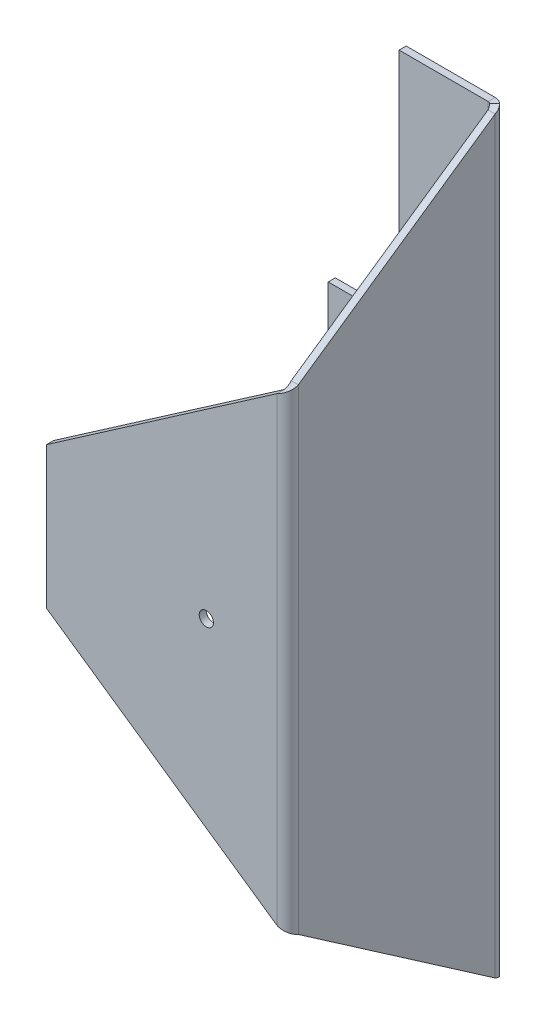
ISO-10303-21;
HEADER;
FILE_DESCRIPTION(('STEP AP214'),'2;1');
FILE_NAME('part.step','',(''),(''),'','','');
FILE_SCHEMA(('AUTOMOTIVE_DESIGN { 1 0 10303 214 1 1 1 1 }'));
ENDSEC;
DATA;
#1=APPLICATION_CONTEXT('core data for automotive mechanical design processes');
#2=APPLICATION_PROTOCOL_DEFINITION('international standard','automotive_design',2000,#1);
#3=PRODUCT_CONTEXT('',#1,'mechanical');
#4=PRODUCT('Part','Part','',(#3));
#5=PRODUCT_RELATED_PRODUCT_CATEGORY('part','',(#4));
#6=PRODUCT_DEFINITION_FORMATION('','',#4);
#7=PRODUCT_DEFINITION_CONTEXT('part definition',#1,'design');
#8=PRODUCT_DEFINITION('design','',#6,#7);
#9=PRODUCT_DEFINITION_SHAPE('','',#8);
#10=(LENGTH_UNIT() NAMED_UNIT(*) SI_UNIT(.MILLI.,.METRE.));
#11=(NAMED_UNIT(*) PLANE_ANGLE_UNIT() SI_UNIT($,.RADIAN.));
#12=(NAMED_UNIT(*) SI_UNIT($,.STERADIAN.) SOLID_ANGLE_UNIT());
#13=UNCERTAINTY_MEASURE_WITH_UNIT(LENGTH_MEASURE(1.E-05),#10,'distance_accuracy_value','');
#14=(GEOMETRIC_REPRESENTATION_CONTEXT(3) GLOBAL_UNCERTAINTY_ASSIGNED_CONTEXT((#13)) GLOBAL_UNIT_ASSIGNED_CONTEXT((#10,
#11,#12)) REPRESENTATION_CONTEXT('',''));
#15=CARTESIAN_POINT('',(0.,0.,0.));
#16=DIRECTION('',(0.,0.,1.));
#17=DIRECTION('',(1.,0.,0.));
#18=AXIS2_PLACEMENT_3D('',#15,#16,#17);
#19=CARTESIAN_POINT('',(83.9999999999999,0.,44.6380541805872));
#20=DIRECTION('',(0.,0.,-1.));
#21=DIRECTION('',(-1.,0.,0.));
#22=AXIS2_PLACEMENT_3D('',#19,#20,#21);
#23=PLANE('',#22);
#24=DIRECTION('',(-0.822507068450492,0.568754887758319,0.));
#25=VECTOR('',#24,1.);
#26=CARTESIAN_POINT('',(63.9999999999998,0.,44.638054180587));
#27=LINE('',#26,#25);
#28=CARTESIAN_POINT('',(18.8324270902932,31.2328961609673,44.6380541805867));
#29=VERTEX_POINT('',#28);
#30=CARTESIAN_POINT('',(-30.0000000000002,65.,44.6380541805864));
#31=VERTEX_POINT('',#30);
#32=EDGE_CURVE('E400',#29,#31,#27,.T.);
#33=ORIENTED_EDGE('',*,*,#32,.F.);
#34=DIRECTION('',(0.,1.,0.));
#35=VECTOR('',#34,1.);
#36=CARTESIAN_POINT('',(18.8324270902932,0.,44.6380541805867));
#37=LINE('',#36,#35);
#38=CARTESIAN_POINT('',(18.8324270902932,128.767103839033,44.6380541805867));
#39=VERTEX_POINT('',#38);
#40=EDGE_CURVE('E564',#29,#39,#37,.T.);
#41=ORIENTED_EDGE('',*,*,#40,.T.);
#42=DIRECTION('',(0.822507068450492,0.568754887758319,0.));
#43=VECTOR('',#42,1.);
#44=CARTESIAN_POINT('',(63.9999999999999,160.,44.638054180587));
#45=LINE('',#44,#43);
#46=CARTESIAN_POINT('',(-30.0000000000002,95.,44.6380541805864));
#47=VERTEX_POINT('',#46);
#48=EDGE_CURVE('E559',#47,#39,#45,.T.);
#49=ORIENTED_EDGE('',*,*,#48,.F.);
#50=DIRECTION('',(0.,1.,0.));
#51=VECTOR('',#50,1.);
#52=CARTESIAN_POINT('',(-30.0000000000002,95.,44.6380541805864));
#53=LINE('',#52,#51);
#54=EDGE_CURVE('E442',#31,#47,#53,.T.);
#55=ORIENTED_EDGE('',*,*,#54,.F.);
#56=EDGE_LOOP('',(#33,#41,#49,#55));
#57=FACE_BOUND('',#56,.T.);
#58=CARTESIAN_POINT('',(3.8324270902932,80.,44.6380541805866));
#59=DIRECTION('',(0.,0.,1.));
#60=DIRECTION('',(1.,0.,0.));
#61=AXIS2_PLACEMENT_3D('',#58,#59,#60);
#62=CIRCLE('',#61,1.49999999999999);
#63=CARTESIAN_POINT('',(5.33242709029318,80.,44.6380541805866));
#64=VERTEX_POINT('',#63);
#65=EDGE_CURVE('E323',#64,#64,#62,.T.);
#66=ORIENTED_EDGE('',*,*,#65,.F.);
#67=EDGE_LOOP('',(#66));
#68=FACE_BOUND('',#67,.T.);
#69=ADVANCED_FACE('F84',(#57,#68),#23,.F.);
#70=CARTESIAN_POINT('',(21.0690270902934,0.,-20.4309729097066));
#71=DIRECTION('',(-1.,0.,0.));
#72=DIRECTION('',(0.,0.,1.));
#73=AXIS2_PLACEMENT_3D('',#70,#71,#72);
#74=PLANE('',#73);
#75=DIRECTION('',(0.,0.568754887758319,0.822507068450492));
#76=VECTOR('',#75,1.);
#77=CARTESIAN_POINT('',(21.0690270902934,0.,-0.430972909706617));
#78=LINE('',#77,#76);
#79=CARTESIAN_POINT('',(21.0690270902934,0.807364246073722,0.736600000000007));
#80=VERTEX_POINT('',#79);
#81=CARTESIAN_POINT('',(21.0690270902932,29.6181676688199,42.4014541805867));
#82=VERTEX_POINT('',#81);
#83=EDGE_CURVE('E364',#80,#82,#78,.T.);
#84=ORIENTED_EDGE('',*,*,#83,.F.);
#85=DIRECTION('',(0.,1.,0.));
#86=VECTOR('',#85,1.);
#87=CARTESIAN_POINT('',(21.0690270902934,0.,0.736600000000007));
#88=LINE('',#87,#86);
#89=CARTESIAN_POINT('',(21.0690270902933,159.192635753926,0.736600000000011));
#90=VERTEX_POINT('',#89);
#91=EDGE_CURVE('E244',#80,#90,#88,.T.);
#92=ORIENTED_EDGE('',*,*,#91,.T.);
#93=DIRECTION('',(0.,0.568754887758319,-0.822507068450492));
#94=VECTOR('',#93,1.);
#95=CARTESIAN_POINT('',(21.0690270902934,160.,-0.430972909706655));
#96=LINE('',#95,#94);
#97=CARTESIAN_POINT('',(21.0690270902932,130.38183233118,42.4014541805867));
#98=VERTEX_POINT('',#97);
#99=EDGE_CURVE('E383',#98,#90,#96,.T.);
#100=ORIENTED_EDGE('',*,*,#99,.F.);
#101=DIRECTION('',(0.,1.,0.));
#102=VECTOR('',#101,1.);
#103=CARTESIAN_POINT('',(21.0690270902932,0.,42.4014541805867));
#104=LINE('',#103,#102);
#105=EDGE_CURVE('E387',#82,#98,#104,.T.);
#106=ORIENTED_EDGE('',*,*,#105,.F.);
#107=EDGE_LOOP('',(#84,#92,#100,#106));
#108=FACE_BOUND('',#107,.T.);
#109=ADVANCED_FACE('F736',(#108),#74,.F.);
#110=CARTESIAN_POINT('',(21.0690270902934,160.,-0.430972909706655));
#111=DIRECTION('',(0.,0.822507068450492,0.568754887758319));
#112=DIRECTION('',(0.,0.568754887758319,-0.822507068450492));
#113=AXIS2_PLACEMENT_3D('',#110,#111,#112);
#114=PLANE('',#113);
#115=CARTESIAN_POINT('',(19.5690270902934,159.192635753926,0.7366));
#116=CARTESIAN_POINT('',(21.0690270902934,159.192635753926,0.736599999999999));
#117=B_SPLINE_CURVE_WITH_KNOTS('',1,(#115,#116),.UNSPECIFIED.,.F.,.F.,(2,2),(0.,1.),.UNSPECIFIED.);
#118=CARTESIAN_POINT('',(19.5690270902934,159.192635753926,0.7366));
#119=VERTEX_POINT('',#118);
#120=EDGE_CURVE('E14',#119,#90,#117,.T.);
#121=ORIENTED_EDGE('',*,*,#120,.F.);
#122=DIRECTION('',(0.,0.568754887758319,-0.822507068450492));
#123=VECTOR('',#122,1.);
#124=CARTESIAN_POINT('',(19.5690270902934,160.,-0.430972909706662));
#125=LINE('',#124,#123);
#126=CARTESIAN_POINT('',(19.5690270902932,130.38183233118,42.4014541805867));
#127=VERTEX_POINT('',#126);
#128=EDGE_CURVE('E358',#127,#119,#125,.T.);
#129=ORIENTED_EDGE('',*,*,#128,.F.);
#130=CARTESIAN_POINT('',(21.0690270902932,130.38183233118,42.4014541805867));
#131=CARTESIAN_POINT('',(19.5690270902932,130.38183233118,42.4014541805867));
#132=B_SPLINE_CURVE_WITH_KNOTS('',1,(#130,#131),.UNSPECIFIED.,.F.,.F.,(2,2),(0.,1.),.UNSPECIFIED.);
#133=EDGE_CURVE('E389',#127,#98,#132,.F.);
#134=ORIENTED_EDGE('',*,*,#133,.T.);
#135=ORIENTED_EDGE('',*,*,#99,.T.);
#136=EDGE_LOOP('',(#121,#129,#134,#135));
#137=FACE_BOUND('',#136,.T.);
#138=ADVANCED_FACE('F86',(#137),#114,.T.);
#139=CARTESIAN_POINT('',(21.0690270902934,0.,-0.430972909706617));
#140=DIRECTION('',(0.,-0.822507068450492,0.568754887758319));
#141=DIRECTION('',(0.,0.568754887758319,0.822507068450492));
#142=AXIS2_PLACEMENT_3D('',#139,#140,#141);
#143=PLANE('',#142);
#144=CARTESIAN_POINT('',(21.0690270902934,0.807364246073722,0.736599999999999));
#145=CARTESIAN_POINT('',(19.5690270902934,0.807364246073722,0.7366));
#146=B_SPLINE_CURVE_WITH_KNOTS('',1,(#144,#145),.UNSPECIFIED.,.F.,.F.,(2,2),(0.,1.),.UNSPECIFIED.);
#147=CARTESIAN_POINT('',(19.5690270902934,0.807364246073722,0.736600000000002));
#148=VERTEX_POINT('',#147);
#149=EDGE_CURVE('E1063',#80,#148,#146,.T.);
#150=ORIENTED_EDGE('',*,*,#149,.F.);
#151=ORIENTED_EDGE('',*,*,#83,.T.);
#152=CARTESIAN_POINT('',(19.5690270902932,29.6181676688199,42.4014541805867));
#153=CARTESIAN_POINT('',(21.0690270902932,29.6181676688199,42.4014541805867));
#154=B_SPLINE_CURVE_WITH_KNOTS('',1,(#152,#153),.UNSPECIFIED.,.F.,.F.,(2,2),(0.,1.),.UNSPECIFIED.);
#155=CARTESIAN_POINT('',(19.5690270902932,29.6181676688198,42.4014541805867));
#156=VERTEX_POINT('',#155);
#157=EDGE_CURVE('E510',#82,#156,#154,.F.);
#158=ORIENTED_EDGE('',*,*,#157,.T.);
#159=DIRECTION('',(0.,0.568754887758319,0.822507068450492));
#160=VECTOR('',#159,1.);
#161=CARTESIAN_POINT('',(19.5690270902934,0.,-0.430972909706624));
#162=LINE('',#161,#160);
#163=EDGE_CURVE('E352',#148,#156,#162,.T.);
#164=ORIENTED_EDGE('',*,*,#163,.F.);
#165=EDGE_LOOP('',(#150,#151,#158,#164));
#166=FACE_BOUND('',#165,.T.);
#167=ADVANCED_FACE('F778',(#166),#143,.T.);
#168=CARTESIAN_POINT('',(19.5690270902934,0.,-20.4309729097067));
#169=DIRECTION('',(-1.,0.,0.));
#170=DIRECTION('',(0.,0.,1.));
#171=AXIS2_PLACEMENT_3D('',#168,#169,#170);
#172=PLANE('',#171);
#173=DIRECTION('',(0.,1.,0.));
#174=VECTOR('',#173,1.);
#175=CARTESIAN_POINT('',(19.5690270902934,0.,0.7366));
#176=LINE('',#175,#174);
#177=EDGE_CURVE('E95',#148,#119,#176,.T.);
#178=ORIENTED_EDGE('',*,*,#177,.F.);
#179=ORIENTED_EDGE('',*,*,#163,.T.);
#180=DIRECTION('',(0.,1.,0.));
#181=VECTOR('',#180,1.);
#182=CARTESIAN_POINT('',(19.5690270902932,0.,42.4014541805867));
#183=LINE('',#182,#181);
#184=EDGE_CURVE('E533',#156,#127,#183,.T.);
#185=ORIENTED_EDGE('',*,*,#184,.T.);
#186=ORIENTED_EDGE('',*,*,#128,.T.);
#187=EDGE_LOOP('',(#178,#179,#185,#186));
#188=FACE_BOUND('',#187,.T.);
#189=ADVANCED_FACE('F772',(#188),#172,.T.);
#190=CARTESIAN_POINT('',(18.8324270902932,31.2328961609674,44.6380541805867));
#191=CARTESIAN_POINT('',(19.1252409254243,31.0983154235121,44.6380541805867));
#192=CARTESIAN_POINT('',(19.4178524084512,30.9637747456094,44.5798414692231));
#193=CARTESIAN_POINT('',(19.9588213017907,30.6946533302515,44.3557648167798));
#194=CARTESIAN_POINT('',(20.2069222841891,30.5600926225726,44.1899890402945));
#195=CARTESIAN_POINT('',(20.620961950001,30.2909712072147,43.7759493744826));
#196=CARTESIAN_POINT('',(20.7867377264863,30.1564104995357,43.5278483920843));
#197=CARTESIAN_POINT('',(21.0108143789296,29.8872890841778,42.9868794987447));
#198=CARTESIAN_POINT('',(21.0690270902932,29.7527484062751,42.6942680157179));
#199=CARTESIAN_POINT('',(21.0690270902932,29.6181676688199,42.4014541805867));
#200=CARTESIAN_POINT('',(18.8324270902932,31.2328961609674,43.1380541805867));
#201=CARTESIAN_POINT('',(18.9288537026675,31.0983272224992,43.1380541805867));
#202=CARTESIAN_POINT('',(19.0252305819122,30.9637747456094,43.1188824542206));
#203=CARTESIAN_POINT('',(19.2033928312344,30.6946533302515,43.0450852342485));
#204=CARTESIAN_POINT('',(19.2851022042267,30.5600926225726,42.9904887766972));
#205=CARTESIAN_POINT('',(19.4214616864037,30.2909712072147,42.8541292945202));
#206=CARTESIAN_POINT('',(19.476058143955,30.1564104995357,42.7724199215279));
#207=CARTESIAN_POINT('',(19.5498553639271,29.8872890841778,42.5942576722057));
#208=CARTESIAN_POINT('',(19.5690270902932,29.7527366072881,42.497880792961));
#209=CARTESIAN_POINT('',(19.5690270902932,29.6181676688199,42.4014541805867));
#210=B_SPLINE_SURFACE_WITH_KNOTS('',1,3,((#190,#191,#192,#193,#194,#195,#196,#197,#198,#199),
(#200,#201,#202,#203,#204,#205,#206,#207,#208,#209)),.UNSPECIFIED.,.F.,.F.,.F.,(2,2),(4,2,2,2,
4),(0.,1.),(0.,0.25,0.5,0.75,1.),.UNSPECIFIED.);
#211=CARTESIAN_POINT('',(18.8324270902932,31.2328961609674,44.6380541805867));
#212=CARTESIAN_POINT('',(18.8324270902932,31.2328961609674,43.1380541805867));
#213=B_SPLINE_CURVE_WITH_KNOTS('',1,(#211,#212),.UNSPECIFIED.,.F.,.F.,(2,2),(0.,1.),.UNSPECIFIED.);
#214=CARTESIAN_POINT('',(18.8324270902932,31.2328961609673,43.1380541805867));
#215=VERTEX_POINT('',#214);
#216=EDGE_CURVE('E520',#29,#215,#213,.T.);
#217=CARTESIAN_POINT('',(18.8324270902932,31.2328961609674,43.1380541805867));
#218=CARTESIAN_POINT('',(18.9288537026675,31.0983272224992,43.1380541805867));
#219=CARTESIAN_POINT('',(19.0252305819122,30.9637747456094,43.1188824542206));
#220=CARTESIAN_POINT('',(19.2033928312344,30.6946533302515,43.0450852342485));
#221=CARTESIAN_POINT('',(19.2851022042267,30.5600926225726,42.9904887766972));
#222=CARTESIAN_POINT('',(19.4214616864037,30.2909712072147,42.8541292945202));
#223=CARTESIAN_POINT('',(19.476058143955,30.1564104995357,42.7724199215279));
#224=CARTESIAN_POINT('',(19.5498553639271,29.8872890841778,42.5942576722057));
#225=CARTESIAN_POINT('',(19.5690270902932,29.7527366072881,42.497880792961));
#226=CARTESIAN_POINT('',(19.5690270902932,29.6181676688199,42.4014541805867));
#227=B_SPLINE_CURVE_WITH_KNOTS('',3,(#217,#218,#219,#220,#221,#222,#223,#224,#225,#226),
.UNSPECIFIED.,.F.,.F.,(4,2,2,2,4),(0.,0.25,0.5,0.75,1.),.UNSPECIFIED.);
#228=EDGE_CURVE('E102',#215,#156,#227,.T.);
#229=CARTESIAN_POINT('',(21.0690270902932,29.6181676688199,42.4014541805867));
#230=CARTESIAN_POINT('',(21.0690270902932,29.7527484062751,42.6942680157179));
#231=CARTESIAN_POINT('',(21.0108143789296,29.8872890841778,42.9868794987447));
#232=CARTESIAN_POINT('',(20.7867377264863,30.1564104995357,43.5278483920843));
#233=CARTESIAN_POINT('',(20.620961950001,30.2909712072147,43.7759493744826));
#234=CARTESIAN_POINT('',(20.2069222841891,30.5600926225726,44.1899890402945));
#235=CARTESIAN_POINT('',(19.9588213017907,30.6946533302515,44.3557648167798));
#236=CARTESIAN_POINT('',(19.4178524084512,30.9637747456094,44.5798414692231));
#237=CARTESIAN_POINT('',(19.1252409254243,31.0983154235121,44.6380541805867));
#238=CARTESIAN_POINT('',(18.8324270902932,31.2328961609674,44.6380541805867));
#239=B_SPLINE_CURVE_WITH_KNOTS('',3,(#229,#230,#231,#232,#233,#234,#235,#236,#237,#238),
.UNSPECIFIED.,.F.,.F.,(4,2,2,2,4),(0.,0.25,0.5,0.75,1.),.UNSPECIFIED.);
#240=EDGE_CURVE('E344',#29,#82,#239,.F.);
#241=ORIENTED_EDGE('',*,*,#216,.T.);
#242=ORIENTED_EDGE('',*,*,#228,.T.);
#243=ORIENTED_EDGE('',*,*,#157,.F.);
#244=ORIENTED_EDGE('',*,*,#240,.F.);
#245=EDGE_LOOP('',(#241,#242,#243,#244));
#246=FACE_BOUND('',#245,.T.);
#247=ADVANCED_FACE('F481',(#246),#210,.T.);
#248=CARTESIAN_POINT('',(21.0690270902932,130.38183233118,42.4014541805867));
#249=CARTESIAN_POINT('',(21.0690270902932,130.247251593725,42.6942680157178));
#250=CARTESIAN_POINT('',(21.0108143789296,130.112710915822,42.9868794987447));
#251=CARTESIAN_POINT('',(20.7867377264863,129.843589500464,43.5278483920843));
#252=CARTESIAN_POINT('',(20.620961950001,129.709028792785,43.7759493744826));
#253=CARTESIAN_POINT('',(20.2069222841891,129.439907377427,44.1899890402945));
#254=CARTESIAN_POINT('',(19.9588213017908,129.305346669749,44.3557648167798));
#255=CARTESIAN_POINT('',(19.4178524084512,129.036225254391,44.5798414692231));
#256=CARTESIAN_POINT('',(19.1252409254243,128.901684576488,44.6380541805867));
#257=CARTESIAN_POINT('',(18.8324270902932,128.767103839033,44.6380541805867));
#258=CARTESIAN_POINT('',(19.5690270902932,130.38183233118,42.4014541805867));
#259=CARTESIAN_POINT('',(19.5690270902932,130.247263392712,42.497880792961));
#260=CARTESIAN_POINT('',(19.5498553639271,130.112710915822,42.5942576722057));
#261=CARTESIAN_POINT('',(19.476058143955,129.843589500464,42.7724199215279));
#262=CARTESIAN_POINT('',(19.4214616864037,129.709028792785,42.8541292945202));
#263=CARTESIAN_POINT('',(19.2851022042267,129.439907377427,42.9904887766972));
#264=CARTESIAN_POINT('',(19.2033928312344,129.305346669749,43.0450852342485));
#265=CARTESIAN_POINT('',(19.0252305819123,129.036225254391,43.1188824542206));
#266=CARTESIAN_POINT('',(18.9288537026675,128.901672777501,43.1380541805867));
#267=CARTESIAN_POINT('',(18.8324270902932,128.767103839033,43.1380541805867));
#268=B_SPLINE_SURFACE_WITH_KNOTS('',1,3,((#248,#249,#250,#251,#252,#253,#254,#255,#256,#257),
(#258,#259,#260,#261,#262,#263,#264,#265,#266,#267)),.UNSPECIFIED.,.F.,.F.,.F.,(2,2),(4,2,2,2,
4),(0.,1.),(0.,0.25,0.5,0.75,1.),.UNSPECIFIED.);
#269=CARTESIAN_POINT('',(19.5690270902932,130.38183233118,42.4014541805867));
#270=CARTESIAN_POINT('',(19.5690270902932,130.247263392712,42.497880792961));
#271=CARTESIAN_POINT('',(19.5498553639271,130.112710915822,42.5942576722057));
#272=CARTESIAN_POINT('',(19.476058143955,129.843589500464,42.7724199215279));
#273=CARTESIAN_POINT('',(19.4214616864037,129.709028792785,42.8541292945202));
#274=CARTESIAN_POINT('',(19.2851022042267,129.439907377427,42.9904887766972));
#275=CARTESIAN_POINT('',(19.2033928312344,129.305346669749,43.0450852342485));
#276=CARTESIAN_POINT('',(19.0252305819123,129.036225254391,43.1188824542206));
#277=CARTESIAN_POINT('',(18.9288537026675,128.901672777501,43.1380541805867));
#278=CARTESIAN_POINT('',(18.8324270902932,128.767103839033,43.1380541805867));
#279=B_SPLINE_CURVE_WITH_KNOTS('',3,(#269,#270,#271,#272,#273,#274,#275,#276,#277,#278),
.UNSPECIFIED.,.F.,.F.,(4,2,2,2,4),(0.,0.25,0.5,0.75,1.),.UNSPECIFIED.);
#280=CARTESIAN_POINT('',(18.8324270902932,128.767103839033,43.1380541805867));
#281=VERTEX_POINT('',#280);
#282=EDGE_CURVE('E349',#127,#281,#279,.T.);
#283=CARTESIAN_POINT('',(18.8324270902932,128.767103839033,43.1380541805867));
#284=CARTESIAN_POINT('',(18.8324270902932,128.767103839033,44.6380541805867));
#285=B_SPLINE_CURVE_WITH_KNOTS('',1,(#283,#284),.UNSPECIFIED.,.F.,.F.,(2,2),(0.,1.),.UNSPECIFIED.);
#286=EDGE_CURVE('E530',#281,#39,#285,.T.);
#287=CARTESIAN_POINT('',(18.8324270902932,128.767103839033,44.6380541805867));
#288=CARTESIAN_POINT('',(19.1252409254243,128.901684576488,44.6380541805867));
#289=CARTESIAN_POINT('',(19.4178524084512,129.036225254391,44.5798414692231));
#290=CARTESIAN_POINT('',(19.9588213017908,129.305346669749,44.3557648167798));
#291=CARTESIAN_POINT('',(20.2069222841891,129.439907377427,44.1899890402945));
#292=CARTESIAN_POINT('',(20.620961950001,129.709028792785,43.7759493744826));
#293=CARTESIAN_POINT('',(20.7867377264863,129.843589500464,43.5278483920843));
#294=CARTESIAN_POINT('',(21.0108143789296,130.112710915822,42.9868794987447));
#295=CARTESIAN_POINT('',(21.0690270902932,130.247251593725,42.6942680157178));
#296=CARTESIAN_POINT('',(21.0690270902932,130.38183233118,42.4014541805867));
#297=B_SPLINE_CURVE_WITH_KNOTS('',3,(#287,#288,#289,#290,#291,#292,#293,#294,#295,#296),
.UNSPECIFIED.,.F.,.F.,(4,2,2,2,4),(0.,0.25,0.5,0.75,1.),.UNSPECIFIED.);
#298=EDGE_CURVE('E348',#98,#39,#297,.F.);
#299=ORIENTED_EDGE('',*,*,#133,.F.);
#300=ORIENTED_EDGE('',*,*,#282,.T.);
#301=ORIENTED_EDGE('',*,*,#286,.T.);
#302=ORIENTED_EDGE('',*,*,#298,.F.);
#303=EDGE_LOOP('',(#299,#300,#301,#302));
#304=FACE_BOUND('',#303,.T.);
#305=ADVANCED_FACE('F429',(#304),#268,.T.);
#306=CARTESIAN_POINT('',(18.8324270902932,180.801880052837,42.4014541805867));
#307=DIRECTION('',(0.,-1.,0.));
#308=DIRECTION('',(1.,0.,0.));
#309=AXIS2_PLACEMENT_3D('',#306,#307,#308);
#310=CYLINDRICAL_SURFACE('',#309,2.2366);
#311=ORIENTED_EDGE('',*,*,#298,.T.);
#312=ORIENTED_EDGE('',*,*,#40,.F.);
#313=ORIENTED_EDGE('',*,*,#240,.T.);
#314=ORIENTED_EDGE('',*,*,#105,.T.);
#315=EDGE_LOOP('',(#311,#312,#313,#314));
#316=FACE_BOUND('',#315,.T.);
#317=ADVANCED_FACE('F424',(#316),#310,.T.);
#318=CARTESIAN_POINT('',(18.8324270902932,180.801880052837,42.4014541805867));
#319=DIRECTION('',(0.,-1.,0.));
#320=DIRECTION('',(1.,0.,0.));
#321=AXIS2_PLACEMENT_3D('',#318,#319,#320);
#322=CYLINDRICAL_SURFACE('',#321,0.7366);
#323=ORIENTED_EDGE('',*,*,#282,.F.);
#324=ORIENTED_EDGE('',*,*,#184,.F.);
#325=ORIENTED_EDGE('',*,*,#228,.F.);
#326=DIRECTION('',(0.,1.,0.));
#327=VECTOR('',#326,1.);
#328=CARTESIAN_POINT('',(18.8324270902932,0.,43.1380541805867));
#329=LINE('',#328,#327);
#330=EDGE_CURVE('E542',#215,#281,#329,.T.);
#331=ORIENTED_EDGE('',*,*,#330,.T.);
#332=EDGE_LOOP('',(#323,#324,#325,#331));
#333=FACE_BOUND('',#332,.T.);
#334=ADVANCED_FACE('F428',(#333),#322,.F.);
#335=CARTESIAN_POINT('',(-30.0000000000002,95.,44.6380541805864));
#336=DIRECTION('',(-1.,0.,0.));
#337=DIRECTION('',(0.,1.,0.));
#338=AXIS2_PLACEMENT_3D('',#335,#336,#337);
#339=PLANE('',#338);
#340=DIRECTION('',(0.,1.,0.));
#341=VECTOR('',#340,1.);
#342=CARTESIAN_POINT('',(-30.0000000000002,95.,43.1380541805864));
#343=LINE('',#342,#341);
#344=CARTESIAN_POINT('',(-30.0000000000002,65.,43.1380541805864));
#345=VERTEX_POINT('',#344);
#346=CARTESIAN_POINT('',(-30.0000000000002,95.,43.1380541805864));
#347=VERTEX_POINT('',#346);
#348=EDGE_CURVE('E555',#345,#347,#343,.T.);
#349=ORIENTED_EDGE('',*,*,#348,.F.);
#350=DIRECTION('',(0.,0.,-1.));
#351=VECTOR('',#350,1.);
#352=CARTESIAN_POINT('',(-30.0000000000002,65.,44.6380541805864));
#353=LINE('',#352,#351);
#354=EDGE_CURVE('E402',#31,#345,#353,.T.);
#355=ORIENTED_EDGE('',*,*,#354,.F.);
#356=ORIENTED_EDGE('',*,*,#54,.T.);
#357=DIRECTION('',(0.,0.,-1.));
#358=VECTOR('',#357,1.);
#359=CARTESIAN_POINT('',(-30.0000000000002,95.,44.6380541805864));
#360=LINE('',#359,#358);
#361=EDGE_CURVE('E569',#47,#347,#360,.T.);
#362=ORIENTED_EDGE('',*,*,#361,.T.);
#363=EDGE_LOOP('',(#349,#355,#356,#362));
#364=FACE_BOUND('',#363,.T.);
#365=ADVANCED_FACE('F580',(#364),#339,.T.);
#366=CARTESIAN_POINT('',(63.9999999999999,160.,44.638054180587));
#367=DIRECTION('',(-0.568754887758319,0.822507068450492,0.));
#368=DIRECTION('',(0.822507068450492,0.568754887758319,0.));
#369=AXIS2_PLACEMENT_3D('',#366,#367,#368);
#370=PLANE('',#369);
#371=ORIENTED_EDGE('',*,*,#286,.F.);
#372=DIRECTION('',(0.822507068450492,0.568754887758319,0.));
#373=VECTOR('',#372,1.);
#374=CARTESIAN_POINT('',(63.9999999999999,160.,43.138054180587));
#375=LINE('',#374,#373);
#376=EDGE_CURVE('E403',#347,#281,#375,.T.);
#377=ORIENTED_EDGE('',*,*,#376,.F.);
#378=ORIENTED_EDGE('',*,*,#361,.F.);
#379=ORIENTED_EDGE('',*,*,#48,.T.);
#380=EDGE_LOOP('',(#371,#377,#378,#379));
#381=FACE_BOUND('',#380,.T.);
#382=ADVANCED_FACE('F576',(#381),#370,.T.);
#383=CARTESIAN_POINT('',(83.9999999999999,0.,43.1380541805872));
#384=DIRECTION('',(0.,0.,-1.));
#385=DIRECTION('',(-1.,0.,0.));
#386=AXIS2_PLACEMENT_3D('',#383,#384,#385);
#387=PLANE('',#386);
#388=CARTESIAN_POINT('',(3.8324270902932,80.,43.1380541805866));
#389=DIRECTION('',(0.,0.,-1.));
#390=DIRECTION('',(-1.,0.,0.));
#391=AXIS2_PLACEMENT_3D('',#388,#389,#390);
#392=CIRCLE('',#391,1.49999999999999);
#393=CARTESIAN_POINT('',(2.3324270902932,80.,43.1380541805866));
#394=VERTEX_POINT('',#393);
#395=EDGE_CURVE('E318',#394,#394,#392,.T.);
#396=ORIENTED_EDGE('',*,*,#395,.F.);
#397=EDGE_LOOP('',(#396));
#398=FACE_BOUND('',#397,.T.);
#399=ORIENTED_EDGE('',*,*,#330,.F.);
#400=DIRECTION('',(-0.822507068450492,0.568754887758319,0.));
#401=VECTOR('',#400,1.);
#402=CARTESIAN_POINT('',(63.9999999999998,0.,43.138054180587));
#403=LINE('',#402,#401);
#404=EDGE_CURVE('E558',#215,#345,#403,.T.);
#405=ORIENTED_EDGE('',*,*,#404,.T.);
#406=ORIENTED_EDGE('',*,*,#348,.T.);
#407=ORIENTED_EDGE('',*,*,#376,.T.);
#408=EDGE_LOOP('',(#399,#405,#406,#407));
#409=FACE_BOUND('',#408,.T.);
#410=ADVANCED_FACE('F421',(#398,#409),#387,.T.);
#411=CARTESIAN_POINT('',(63.9999999999998,0.,44.638054180587));
#412=DIRECTION('',(-0.568754887758319,-0.822507068450492,0.));
#413=DIRECTION('',(-0.822507068450492,0.568754887758319,0.));
#414=AXIS2_PLACEMENT_3D('',#411,#412,#413);
#415=PLANE('',#414);
#416=ORIENTED_EDGE('',*,*,#216,.F.);
#417=ORIENTED_EDGE('',*,*,#32,.T.);
#418=ORIENTED_EDGE('',*,*,#354,.T.);
#419=ORIENTED_EDGE('',*,*,#404,.F.);
#420=EDGE_LOOP('',(#416,#417,#418,#419));
#421=FACE_BOUND('',#420,.T.);
#422=ADVANCED_FACE('F410',(#421),#415,.T.);
#423=CARTESIAN_POINT('',(-6.69448325061239,100.,-1.5));
#424=DIRECTION('',(0.,0.,1.));
#425=DIRECTION('',(1.,0.,0.));
#426=AXIS2_PLACEMENT_3D('',#423,#424,#425);
#427=CYLINDRICAL_SURFACE('',#426,2.5);
#428=CARTESIAN_POINT('',(-6.69448325061239,100.,-1.5));
#429=DIRECTION('',(0.,0.,1.));
#430=DIRECTION('',(1.,0.,0.));
#431=AXIS2_PLACEMENT_3D('',#428,#429,#430);
#432=CIRCLE('',#431,2.5);
#433=CARTESIAN_POINT('',(-4.19448325061239,100.,-1.5));
#434=VERTEX_POINT('',#433);
#435=EDGE_CURVE('E620',#434,#434,#432,.T.);
#436=ORIENTED_EDGE('',*,*,#435,.F.);
#437=EDGE_LOOP('',(#436));
#438=FACE_BOUND('',#437,.T.);
#439=CARTESIAN_POINT('',(-6.69448325061239,100.,0.));
#440=DIRECTION('',(0.,0.,1.));
#441=DIRECTION('',(1.,0.,0.));
#442=AXIS2_PLACEMENT_3D('',#439,#440,#441);
#443=CIRCLE('',#442,2.5);
#444=CARTESIAN_POINT('',(-4.19448325061239,100.,0.));
#445=VERTEX_POINT('',#444);
#446=EDGE_CURVE('E586',#445,#445,#443,.T.);
#447=ORIENTED_EDGE('',*,*,#446,.T.);
#448=EDGE_LOOP('',(#447));
#449=FACE_BOUND('',#448,.T.);
#450=ADVANCED_FACE('F420',(#438,#449),#427,.F.);
#451=CARTESIAN_POINT('',(-6.69448325061239,60.,-1.5));
#452=DIRECTION('',(0.,0.,1.));
#453=DIRECTION('',(1.,0.,0.));
#454=AXIS2_PLACEMENT_3D('',#451,#452,#453);
#455=CYLINDRICAL_SURFACE('',#454,2.5);
#456=CARTESIAN_POINT('',(-6.69448325061239,60.,-1.5));
#457=DIRECTION('',(0.,0.,1.));
#458=DIRECTION('',(1.,0.,0.));
#459=AXIS2_PLACEMENT_3D('',#456,#457,#458);
#460=CIRCLE('',#459,2.5);
#461=CARTESIAN_POINT('',(-4.19448325061239,60.,-1.5));
#462=VERTEX_POINT('',#461);
#463=EDGE_CURVE('E617',#462,#462,#460,.T.);
#464=ORIENTED_EDGE('',*,*,#463,.F.);
#465=EDGE_LOOP('',(#464));
#466=FACE_BOUND('',#465,.T.);
#467=CARTESIAN_POINT('',(-6.69448325061239,60.,0.));
#468=DIRECTION('',(0.,0.,1.));
#469=DIRECTION('',(1.,0.,0.));
#470=AXIS2_PLACEMENT_3D('',#467,#468,#469);
#471=CIRCLE('',#470,2.5);
#472=CARTESIAN_POINT('',(-4.19448325061239,60.,0.));
#473=VERTEX_POINT('',#472);
#474=EDGE_CURVE('E589',#473,#473,#471,.T.);
#475=ORIENTED_EDGE('',*,*,#474,.T.);
#476=EDGE_LOOP('',(#475));
#477=FACE_BOUND('',#476,.T.);
#478=ADVANCED_FACE('F985',(#466,#477),#455,.F.);
#479=CARTESIAN_POINT('',(0.,110.,-1.5));
#480=DIRECTION('',(-1.,0.,0.));
#481=DIRECTION('',(0.,-1.,0.));
#482=AXIS2_PLACEMENT_3D('',#479,#480,#481);
#483=PLANE('',#482);
#484=DIRECTION('',(0.,-1.,0.));
#485=VECTOR('',#484,1.);
#486=CARTESIAN_POINT('',(0.,110.,0.));
#487=LINE('',#486,#485);
#488=CARTESIAN_POINT('',(0.,160.,0.));
#489=VERTEX_POINT('',#488);
#490=CARTESIAN_POINT('',(0.,110.,0.));
#491=VERTEX_POINT('',#490);
#492=EDGE_CURVE('E635',#489,#491,#487,.T.);
#493=ORIENTED_EDGE('',*,*,#492,.F.);
#494=DIRECTION('',(0.,0.,1.));
#495=VECTOR('',#494,1.);
#496=CARTESIAN_POINT('',(0.,160.,-1.5));
#497=LINE('',#496,#495);
#498=CARTESIAN_POINT('',(0.,160.,-1.5));
#499=VERTEX_POINT('',#498);
#500=EDGE_CURVE('E546',#499,#489,#497,.T.);
#501=ORIENTED_EDGE('',*,*,#500,.F.);
#502=DIRECTION('',(0.,-1.,0.));
#503=VECTOR('',#502,1.);
#504=CARTESIAN_POINT('',(0.,110.,-1.5));
#505=LINE('',#504,#503);
#506=CARTESIAN_POINT('',(0.,110.,-1.5));
#507=VERTEX_POINT('',#506);
#508=EDGE_CURVE('E592',#499,#507,#505,.T.);
#509=ORIENTED_EDGE('',*,*,#508,.T.);
#510=DIRECTION('',(0.,0.,1.));
#511=VECTOR('',#510,1.);
#512=CARTESIAN_POINT('',(0.,110.,-1.5));
#513=LINE('',#512,#511);
#514=EDGE_CURVE('E595',#507,#491,#513,.T.);
#515=ORIENTED_EDGE('',*,*,#514,.T.);
#516=EDGE_LOOP('',(#493,#501,#509,#515));
#517=FACE_BOUND('',#516,.T.);
#518=ADVANCED_FACE('F974',(#517),#483,.T.);
#519=CARTESIAN_POINT('',(0.,110.,-1.5));
#520=DIRECTION('',(0.,1.,0.));
#521=DIRECTION('',(0.,0.,1.));
#522=AXIS2_PLACEMENT_3D('',#519,#520,#521);
#523=PLANE('',#522);
#524=DIRECTION('',(-1.,0.,0.));
#525=VECTOR('',#524,1.);
#526=CARTESIAN_POINT('',(0.,110.,0.));
#527=LINE('',#526,#525);
#528=CARTESIAN_POINT('',(-15.,110.,0.));
#529=VERTEX_POINT('',#528);
#530=EDGE_CURVE('E638',#491,#529,#527,.T.);
#531=ORIENTED_EDGE('',*,*,#530,.F.);
#532=ORIENTED_EDGE('',*,*,#514,.F.);
#533=DIRECTION('',(-1.,0.,0.));
#534=VECTOR('',#533,1.);
#535=CARTESIAN_POINT('',(0.,110.,-1.5));
#536=LINE('',#535,#534);
#537=CARTESIAN_POINT('',(-15.,110.,-1.5));
#538=VERTEX_POINT('',#537);
#539=EDGE_CURVE('E597',#507,#538,#536,.T.);
#540=ORIENTED_EDGE('',*,*,#539,.T.);
#541=DIRECTION('',(0.,0.,1.));
#542=VECTOR('',#541,1.);
#543=CARTESIAN_POINT('',(-15.,110.,-1.5));
#544=LINE('',#543,#542);
#545=EDGE_CURVE('E600',#538,#529,#544,.T.);
#546=ORIENTED_EDGE('',*,*,#545,.T.);
#547=EDGE_LOOP('',(#531,#532,#540,#546));
#548=FACE_BOUND('',#547,.T.);
#549=ADVANCED_FACE('F963',(#548),#523,.T.);
#550=CARTESIAN_POINT('',(-15.,110.,-1.5));
#551=DIRECTION('',(-1.,0.,0.));
#552=DIRECTION('',(0.,-1.,0.));
#553=AXIS2_PLACEMENT_3D('',#550,#551,#552);
#554=PLANE('',#553);
#555=DIRECTION('',(0.,-1.,0.));
#556=VECTOR('',#555,1.);
#557=CARTESIAN_POINT('',(-15.,110.,0.));
#558=LINE('',#557,#556);
#559=CARTESIAN_POINT('',(-15.,50.,0.));
#560=VERTEX_POINT('',#559);
#561=EDGE_CURVE('E641',#529,#560,#558,.T.);
#562=ORIENTED_EDGE('',*,*,#561,.F.);
#563=ORIENTED_EDGE('',*,*,#545,.F.);
#564=DIRECTION('',(0.,-1.,0.));
#565=VECTOR('',#564,1.);
#566=CARTESIAN_POINT('',(-15.,110.,-1.5));
#567=LINE('',#566,#565);
#568=CARTESIAN_POINT('',(-15.,50.,-1.5));
#569=VERTEX_POINT('',#568);
#570=EDGE_CURVE('E602',#538,#569,#567,.T.);
#571=ORIENTED_EDGE('',*,*,#570,.T.);
#572=DIRECTION('',(0.,0.,1.));
#573=VECTOR('',#572,1.);
#574=CARTESIAN_POINT('',(-15.,50.,-1.5));
#575=LINE('',#574,#573);
#576=EDGE_CURVE('E605',#569,#560,#575,.T.);
#577=ORIENTED_EDGE('',*,*,#576,.T.);
#578=EDGE_LOOP('',(#562,#563,#571,#577));
#579=FACE_BOUND('',#578,.T.);
#580=ADVANCED_FACE('F952',(#579),#554,.T.);
#581=CARTESIAN_POINT('',(0.,50.,-1.5));
#582=DIRECTION('',(0.,-1.,0.));
#583=DIRECTION('',(1.,0.,0.));
#584=AXIS2_PLACEMENT_3D('',#581,#582,#583);
#585=PLANE('',#584);
#586=DIRECTION('',(1.,0.,0.));
#587=VECTOR('',#586,1.);
#588=CARTESIAN_POINT('',(0.,50.,0.));
#589=LINE('',#588,#587);
#590=CARTESIAN_POINT('',(0.,50.,0.));
#591=VERTEX_POINT('',#590);
#592=EDGE_CURVE('E644',#560,#591,#589,.T.);
#593=ORIENTED_EDGE('',*,*,#592,.F.);
#594=ORIENTED_EDGE('',*,*,#576,.F.);
#595=DIRECTION('',(1.,0.,0.));
#596=VECTOR('',#595,1.);
#597=CARTESIAN_POINT('',(0.,50.,-1.5));
#598=LINE('',#597,#596);
#599=CARTESIAN_POINT('',(0.,50.,-1.5));
#600=VERTEX_POINT('',#599);
#601=EDGE_CURVE('E607',#569,#600,#598,.T.);
#602=ORIENTED_EDGE('',*,*,#601,.T.);
#603=DIRECTION('',(0.,0.,1.));
#604=VECTOR('',#603,1.);
#605=CARTESIAN_POINT('',(0.,50.,-1.5));
#606=LINE('',#605,#604);
#607=EDGE_CURVE('E610',#600,#591,#606,.T.);
#608=ORIENTED_EDGE('',*,*,#607,.T.);
#609=EDGE_LOOP('',(#593,#594,#602,#608));
#610=FACE_BOUND('',#609,.T.);
#611=ADVANCED_FACE('F941',(#610),#585,.T.);
#612=CARTESIAN_POINT('',(0.,0.,-1.5));
#613=DIRECTION('',(-1.,0.,0.));
#614=DIRECTION('',(0.,-1.,0.));
#615=AXIS2_PLACEMENT_3D('',#612,#613,#614);
#616=PLANE('',#615);
#617=DIRECTION('',(0.,-1.,0.));
#618=VECTOR('',#617,1.);
#619=CARTESIAN_POINT('',(0.,0.,0.));
#620=LINE('',#619,#618);
#621=CARTESIAN_POINT('',(0.,0.,0.));
#622=VERTEX_POINT('',#621);
#623=EDGE_CURVE('E647',#591,#622,#620,.T.);
#624=ORIENTED_EDGE('',*,*,#623,.F.);
#625=ORIENTED_EDGE('',*,*,#607,.F.);
#626=DIRECTION('',(0.,-1.,0.));
#627=VECTOR('',#626,1.);
#628=CARTESIAN_POINT('',(0.,0.,-1.5));
#629=LINE('',#628,#627);
#630=CARTESIAN_POINT('',(0.,0.,-1.5));
#631=VERTEX_POINT('',#630);
#632=EDGE_CURVE('E612',#600,#631,#629,.T.);
#633=ORIENTED_EDGE('',*,*,#632,.T.);
#634=DIRECTION('',(0.,0.,1.));
#635=VECTOR('',#634,1.);
#636=CARTESIAN_POINT('',(0.,0.,-1.5));
#637=LINE('',#636,#635);
#638=EDGE_CURVE('E615',#631,#622,#637,.T.);
#639=ORIENTED_EDGE('',*,*,#638,.T.);
#640=EDGE_LOOP('',(#624,#625,#633,#639));
#641=FACE_BOUND('',#640,.T.);
#642=ADVANCED_FACE('F931',(#641),#616,.T.);
#643=CARTESIAN_POINT('',(0.,0.,-1.5));
#644=DIRECTION('',(0.,0.,1.));
#645=DIRECTION('',(1.,0.,0.));
#646=AXIS2_PLACEMENT_3D('',#643,#644,#645);
#647=PLANE('',#646);
#648=DIRECTION('',(0.,1.,0.));
#649=VECTOR('',#648,1.);
#650=CARTESIAN_POINT('',(18.8324270902934,0.,-1.5));
#651=LINE('',#650,#649);
#652=CARTESIAN_POINT('',(18.8324270902934,0.,-1.5));
#653=VERTEX_POINT('',#652);
#654=CARTESIAN_POINT('',(18.8324270902934,160.,-1.5));
#655=VERTEX_POINT('',#654);
#656=EDGE_CURVE('E229',#653,#655,#651,.T.);
#657=ORIENTED_EDGE('',*,*,#656,.F.);
#658=DIRECTION('',(1.,0.,0.));
#659=VECTOR('',#658,1.);
#660=CARTESIAN_POINT('',(0.,0.,-1.5));
#661=LINE('',#660,#659);
#662=EDGE_CURVE('E623',#631,#653,#661,.T.);
#663=ORIENTED_EDGE('',*,*,#662,.F.);
#664=ORIENTED_EDGE('',*,*,#632,.F.);
#665=ORIENTED_EDGE('',*,*,#601,.F.);
#666=ORIENTED_EDGE('',*,*,#570,.F.);
#667=ORIENTED_EDGE('',*,*,#539,.F.);
#668=ORIENTED_EDGE('',*,*,#508,.F.);
#669=DIRECTION('',(-1.,0.,0.));
#670=VECTOR('',#669,1.);
#671=CARTESIAN_POINT('',(0.,160.,-1.5));
#672=LINE('',#671,#670);
#673=EDGE_CURVE('E653',#655,#499,#672,.T.);
#674=ORIENTED_EDGE('',*,*,#673,.F.);
#675=EDGE_LOOP('',(#657,#663,#664,#665,#666,#667,#668,#674));
#676=FACE_BOUND('',#675,.T.);
#677=ORIENTED_EDGE('',*,*,#463,.T.);
#678=EDGE_LOOP('',(#677));
#679=FACE_BOUND('',#678,.T.);
#680=ORIENTED_EDGE('',*,*,#435,.T.);
#681=EDGE_LOOP('',(#680));
#682=FACE_BOUND('',#681,.T.);
#683=ADVANCED_FACE('F921',(#676,#679,#682),#647,.F.);
#684=CARTESIAN_POINT('',(0.,0.,-1.5));
#685=DIRECTION('',(0.,-1.,0.));
#686=DIRECTION('',(0.,0.,-1.));
#687=AXIS2_PLACEMENT_3D('',#684,#685,#686);
#688=PLANE('',#687);
#689=ORIENTED_EDGE('',*,*,#662,.T.);
#690=DIRECTION('',(0.,0.,1.));
#691=VECTOR('',#690,1.);
#692=CARTESIAN_POINT('',(18.8324270902934,0.,-1.5));
#693=LINE('',#692,#691);
#694=CARTESIAN_POINT('',(18.8324270902934,0.,0.));
#695=VERTEX_POINT('',#694);
#696=EDGE_CURVE('E237',#653,#695,#693,.T.);
#697=ORIENTED_EDGE('',*,*,#696,.T.);
#698=DIRECTION('',(1.,0.,0.));
#699=VECTOR('',#698,1.);
#700=CARTESIAN_POINT('',(0.,0.,0.));
#701=LINE('',#700,#699);
#702=EDGE_CURVE('E627',#622,#695,#701,.T.);
#703=ORIENTED_EDGE('',*,*,#702,.F.);
#704=ORIENTED_EDGE('',*,*,#638,.F.);
#705=EDGE_LOOP('',(#689,#697,#703,#704));
#706=FACE_BOUND('',#705,.T.);
#707=ADVANCED_FACE('F910',(#706),#688,.T.);
#708=CARTESIAN_POINT('',(0.,0.,0.));
#709=DIRECTION('',(0.,0.,1.));
#710=DIRECTION('',(1.,0.,0.));
#711=AXIS2_PLACEMENT_3D('',#708,#709,#710);
#712=PLANE('',#711);
#713=ORIENTED_EDGE('',*,*,#474,.F.);
#714=EDGE_LOOP('',(#713));
#715=FACE_BOUND('',#714,.T.);
#716=ORIENTED_EDGE('',*,*,#446,.F.);
#717=EDGE_LOOP('',(#716));
#718=FACE_BOUND('',#717,.T.);
#719=ORIENTED_EDGE('',*,*,#702,.T.);
#720=DIRECTION('',(0.,1.,0.));
#721=VECTOR('',#720,1.);
#722=CARTESIAN_POINT('',(18.8324270902934,0.,0.));
#723=LINE('',#722,#721);
#724=CARTESIAN_POINT('',(18.8324270902934,160.,0.));
#725=VERTEX_POINT('',#724);
#726=EDGE_CURVE('E630',#695,#725,#723,.T.);
#727=ORIENTED_EDGE('',*,*,#726,.T.);
#728=DIRECTION('',(-1.,0.,0.));
#729=VECTOR('',#728,1.);
#730=CARTESIAN_POINT('',(0.,160.,0.));
#731=LINE('',#730,#729);
#732=EDGE_CURVE('E633',#725,#489,#731,.T.);
#733=ORIENTED_EDGE('',*,*,#732,.T.);
#734=ORIENTED_EDGE('',*,*,#492,.T.);
#735=ORIENTED_EDGE('',*,*,#530,.T.);
#736=ORIENTED_EDGE('',*,*,#561,.T.);
#737=ORIENTED_EDGE('',*,*,#592,.T.);
#738=ORIENTED_EDGE('',*,*,#623,.T.);
#739=EDGE_LOOP('',(#719,#727,#733,#734,#735,#736,#737,#738));
#740=FACE_BOUND('',#739,.T.);
#741=ADVANCED_FACE('F902',(#715,#718,#740),#712,.T.);
#742=CARTESIAN_POINT('',(0.,160.,-1.5));
#743=DIRECTION('',(0.,1.,0.));
#744=DIRECTION('',(0.,0.,1.));
#745=AXIS2_PLACEMENT_3D('',#742,#743,#744);
#746=PLANE('',#745);
#747=ORIENTED_EDGE('',*,*,#732,.F.);
#748=DIRECTION('',(0.,0.,-1.));
#749=VECTOR('',#748,1.);
#750=CARTESIAN_POINT('',(18.8324270902934,160.,-1.5));
#751=LINE('',#750,#749);
#752=EDGE_CURVE('E650',#725,#655,#751,.T.);
#753=ORIENTED_EDGE('',*,*,#752,.T.);
#754=ORIENTED_EDGE('',*,*,#673,.T.);
#755=ORIENTED_EDGE('',*,*,#500,.T.);
#756=EDGE_LOOP('',(#747,#753,#754,#755));
#757=FACE_BOUND('',#756,.T.);
#758=ADVANCED_FACE('F734',(#757),#746,.T.);
#759=CARTESIAN_POINT('',(18.8324270902934,0.,0.7366));
#760=DIRECTION('',(0.,-1.,0.));
#761=DIRECTION('',(1.,0.,0.));
#762=AXIS2_PLACEMENT_3D('',#759,#760,#761);
#763=PLANE('',#762);
#764=CARTESIAN_POINT('',(19.3532819453154,0.,0.215745144977998));
#765=CARTESIAN_POINT('',(20.4139421170952,0.,-0.844915026801806));
#766=B_SPLINE_CURVE_WITH_KNOTS('',1,(#764,#765),.UNSPECIFIED.,.F.,.F.,(2,2),(0.,1.),.UNSPECIFIED.);
#767=CARTESIAN_POINT('',(19.3532819453154,0.,0.215745144977998));
#768=VERTEX_POINT('',#767);
#769=CARTESIAN_POINT('',(20.4139421170952,0.,-0.844915026801804));
#770=VERTEX_POINT('',#769);
#771=EDGE_CURVE('E215',#768,#770,#766,.T.);
#772=ORIENTED_EDGE('',*,*,#771,.F.);
#773=CARTESIAN_POINT('',(18.8324270902934,0.,0.7366));
#774=DIRECTION('',(0.,-1.,0.));
#775=DIRECTION('',(1.,0.,0.));
#776=AXIS2_PLACEMENT_3D('',#773,#774,#775);
#777=CIRCLE('',#776,0.7366);
#778=EDGE_CURVE('E293',#768,#695,#777,.F.);
#779=ORIENTED_EDGE('',*,*,#778,.T.);
#780=ORIENTED_EDGE('',*,*,#696,.F.);
#781=CARTESIAN_POINT('',(18.8324270902934,0.,0.7366));
#782=DIRECTION('',(0.,1.,0.));
#783=DIRECTION('',(1.,0.,0.));
#784=AXIS2_PLACEMENT_3D('',#781,#782,#783);
#785=CIRCLE('',#784,2.2366);
#786=EDGE_CURVE('E234',#770,#653,#785,.T.);
#787=ORIENTED_EDGE('',*,*,#786,.F.);
#788=EDGE_LOOP('',(#772,#779,#780,#787));
#789=FACE_BOUND('',#788,.T.);
#790=ADVANCED_FACE('F235',(#789),#763,.T.);
#791=CARTESIAN_POINT('',(18.8324270902934,160.,0.7366));
#792=DIRECTION('',(0.,1.,0.));
#793=DIRECTION('',(0.,0.,1.));
#794=AXIS2_PLACEMENT_3D('',#791,#792,#793);
#795=PLANE('',#794);
#796=ORIENTED_EDGE('',*,*,#752,.F.);
#797=CARTESIAN_POINT('',(18.8324270902934,160.,0.7366));
#798=DIRECTION('',(0.,-1.,0.));
#799=DIRECTION('',(1.,0.,0.));
#800=AXIS2_PLACEMENT_3D('',#797,#798,#799);
#801=CIRCLE('',#800,0.7366);
#802=CARTESIAN_POINT('',(19.3532819453154,160.,0.215745144977985));
#803=VERTEX_POINT('',#802);
#804=EDGE_CURVE('E284',#725,#803,#801,.T.);
#805=ORIENTED_EDGE('',*,*,#804,.T.);
#806=CARTESIAN_POINT('',(20.4139421170952,160.,-0.844915026801844));
#807=CARTESIAN_POINT('',(19.3532819453154,160.,0.215745144977985));
#808=B_SPLINE_CURVE_WITH_KNOTS('',1,(#806,#807),.UNSPECIFIED.,.F.,.F.,(2,2),(0.,1.),.UNSPECIFIED.);
#809=CARTESIAN_POINT('',(20.4139421170952,160.,-0.844915026801846));
#810=VERTEX_POINT('',#809);
#811=EDGE_CURVE('E230',#803,#810,#808,.F.);
#812=ORIENTED_EDGE('',*,*,#811,.T.);
#813=CARTESIAN_POINT('',(18.8324270902934,160.,0.7366));
#814=DIRECTION('',(0.,-1.,0.));
#815=DIRECTION('',(0.,0.,1.));
#816=AXIS2_PLACEMENT_3D('',#813,#814,#815);
#817=CIRCLE('',#816,2.2366);
#818=EDGE_CURVE('E239',#655,#810,#817,.T.);
#819=ORIENTED_EDGE('',*,*,#818,.F.);
#820=EDGE_LOOP('',(#796,#805,#812,#819));
#821=FACE_BOUND('',#820,.T.);
#822=ADVANCED_FACE('F722',(#821),#795,.T.);
#823=CARTESIAN_POINT('',(20.4139421170952,160.,-0.844915026801844));
#824=CARTESIAN_POINT('',(20.6209927655416,159.865419262545,-0.637864378355395));
#825=CARTESIAN_POINT('',(20.7867377264865,159.730878584642,-0.389794211497564));
#826=CARTESIAN_POINT('',(21.0108143789297,159.461757169284,0.151174681842027));
#827=CARTESIAN_POINT('',(21.0690270902934,159.327216491381,0.443786164868914));
#828=CARTESIAN_POINT('',(21.0690270902934,159.192635753926,0.736599999999999));
#829=CARTESIAN_POINT('',(19.3532819453154,160.,0.215745144977985));
#830=CARTESIAN_POINT('',(19.4214658568121,159.865431061532,0.28392905647469));
#831=CARTESIAN_POINT('',(19.4760581439551,159.730878584642,0.365634259058791));
#832=CARTESIAN_POINT('',(19.5498553639272,159.461757169284,0.543796508380952));
#833=CARTESIAN_POINT('',(19.5690270902934,159.327204692394,0.640173387625748));
#834=CARTESIAN_POINT('',(19.5690270902934,159.192635753926,0.7366));
#835=B_SPLINE_SURFACE_WITH_KNOTS('',1,3,((#823,#824,#825,#826,#827,#828),(#829,#830,#831,#832,
#833,#834)),.UNSPECIFIED.,.F.,.F.,.F.,(2,2),(4,2,4),(0.,1.),(0.,0.5,1.),.UNSPECIFIED.);
#836=CARTESIAN_POINT('',(19.3532819453154,160.,0.215745144977985));
#837=CARTESIAN_POINT('',(19.4214658568121,159.865431061532,0.28392905647469));
#838=CARTESIAN_POINT('',(19.4760581439551,159.730878584642,0.365634259058791));
#839=CARTESIAN_POINT('',(19.5498553639272,159.461757169284,0.543796508380952));
#840=CARTESIAN_POINT('',(19.5690270902934,159.327204692394,0.640173387625748));
#841=CARTESIAN_POINT('',(19.5690270902934,159.192635753926,0.7366));
#842=B_SPLINE_CURVE_WITH_KNOTS('',3,(#836,#837,#838,#839,#840,#841),.UNSPECIFIED.,.F.,.F.,(4,2,
4),(0.,0.5,1.),.UNSPECIFIED.);
#843=EDGE_CURVE('E292',#803,#119,#842,.T.);
#844=CARTESIAN_POINT('',(21.0690270902934,159.192635753926,0.736599999999999));
#845=CARTESIAN_POINT('',(21.0690270902934,159.327216491381,0.443786164868914));
#846=CARTESIAN_POINT('',(21.0108143789297,159.461757169284,0.151174681842027));
#847=CARTESIAN_POINT('',(20.7867377264865,159.730878584642,-0.389794211497564));
#848=CARTESIAN_POINT('',(20.6209927655416,159.865419262545,-0.637864378355395));
#849=CARTESIAN_POINT('',(20.4139421170952,160.,-0.844915026801844));
#850=B_SPLINE_CURVE_WITH_KNOTS('',3,(#844,#845,#846,#847,#848,#849),.UNSPECIFIED.,.F.,.F.,(4,2,
4),(0.,0.5,1.),.UNSPECIFIED.);
#851=EDGE_CURVE('E111',#810,#90,#850,.F.);
#852=ORIENTED_EDGE('',*,*,#811,.F.);
#853=ORIENTED_EDGE('',*,*,#843,.T.);
#854=ORIENTED_EDGE('',*,*,#120,.T.);
#855=ORIENTED_EDGE('',*,*,#851,.F.);
#856=EDGE_LOOP('',(#852,#853,#854,#855));
#857=FACE_BOUND('',#856,.T.);
#858=ADVANCED_FACE('F271',(#857),#835,.T.);
#859=CARTESIAN_POINT('',(21.0690270902934,0.807364246073722,0.736599999999999));
#860=CARTESIAN_POINT('',(21.0690270902934,0.672783508618485,0.443786164868888));
#861=CARTESIAN_POINT('',(21.0108143789297,0.538242830715824,0.151174681842046));
#862=CARTESIAN_POINT('',(20.7867377264865,0.269121415357926,-0.389794211497532));
#863=CARTESIAN_POINT('',(20.6209927655417,0.134580737455232,-0.637864378355361));
#864=CARTESIAN_POINT('',(20.4139421170952,0.,-0.844915026801806));
#865=CARTESIAN_POINT('',(19.5690270902934,0.807364246073722,0.7366));
#866=CARTESIAN_POINT('',(19.5690270902934,0.672795307605539,0.640173387625739));
#867=CARTESIAN_POINT('',(19.5498553639272,0.538242830715824,0.543796508380958));
#868=CARTESIAN_POINT('',(19.4760581439551,0.269121415357926,0.365634259058803));
#869=CARTESIAN_POINT('',(19.4214658568121,0.134568938468174,0.283929056474681));
#870=CARTESIAN_POINT('',(19.3532819453154,0.,0.215745144977998));
#871=B_SPLINE_SURFACE_WITH_KNOTS('',1,3,((#859,#860,#861,#862,#863,#864),(#865,#866,#867,#868,
#869,#870)),.UNSPECIFIED.,.F.,.F.,.F.,(2,2),(4,2,4),(0.,1.),(0.,0.5,1.),.UNSPECIFIED.);
#872=CARTESIAN_POINT('',(19.5690270902934,0.807364246073722,0.7366));
#873=CARTESIAN_POINT('',(19.5690270902934,0.672795307605539,0.640173387625739));
#874=CARTESIAN_POINT('',(19.5498553639272,0.538242830715824,0.543796508380958));
#875=CARTESIAN_POINT('',(19.4760581439551,0.269121415357926,0.365634259058803));
#876=CARTESIAN_POINT('',(19.4214658568121,0.134568938468174,0.283929056474681));
#877=CARTESIAN_POINT('',(19.3532819453154,0.,0.215745144977998));
#878=B_SPLINE_CURVE_WITH_KNOTS('',3,(#872,#873,#874,#875,#876,#877),.UNSPECIFIED.,.F.,.F.,(4,2,
4),(0.,0.5,1.),.UNSPECIFIED.);
#879=EDGE_CURVE('E224',#148,#768,#878,.T.);
#880=CARTESIAN_POINT('',(20.4139421170952,0.,-0.844915026801806));
#881=CARTESIAN_POINT('',(20.6209927655417,0.134580737455232,-0.637864378355361));
#882=CARTESIAN_POINT('',(20.7867377264865,0.269121415357926,-0.389794211497532));
#883=CARTESIAN_POINT('',(21.0108143789297,0.538242830715824,0.151174681842046));
#884=CARTESIAN_POINT('',(21.0690270902934,0.672783508618485,0.443786164868888));
#885=CARTESIAN_POINT('',(21.0690270902934,0.807364246073722,0.736599999999999));
#886=B_SPLINE_CURVE_WITH_KNOTS('',3,(#880,#881,#882,#883,#884,#885),.UNSPECIFIED.,.F.,.F.,(4,2,
4),(0.,0.5,1.),.UNSPECIFIED.);
#887=EDGE_CURVE('E220',#80,#770,#886,.F.);
#888=ORIENTED_EDGE('',*,*,#879,.T.);
#889=ORIENTED_EDGE('',*,*,#771,.T.);
#890=ORIENTED_EDGE('',*,*,#887,.F.);
#891=ORIENTED_EDGE('',*,*,#149,.T.);
#892=EDGE_LOOP('',(#888,#889,#890,#891));
#893=FACE_BOUND('',#892,.T.);
#894=ADVANCED_FACE('F218',(#893),#871,.T.);
#895=CARTESIAN_POINT('',(18.8324270902934,240.024069770763,0.7366));
#896=DIRECTION('',(0.,-1.,0.));
#897=DIRECTION('',(1.,0.,0.));
#898=AXIS2_PLACEMENT_3D('',#895,#896,#897);
#899=CYLINDRICAL_SURFACE('',#898,2.2366);
#900=ORIENTED_EDGE('',*,*,#91,.F.);
#901=ORIENTED_EDGE('',*,*,#887,.T.);
#902=ORIENTED_EDGE('',*,*,#786,.T.);
#903=ORIENTED_EDGE('',*,*,#656,.T.);
#904=ORIENTED_EDGE('',*,*,#818,.T.);
#905=ORIENTED_EDGE('',*,*,#851,.T.);
#906=EDGE_LOOP('',(#900,#901,#902,#903,#904,#905));
#907=FACE_BOUND('',#906,.T.);
#908=ADVANCED_FACE('F242',(#907),#899,.T.);
#909=CARTESIAN_POINT('',(18.8324270902934,240.024069770763,0.7366));
#910=DIRECTION('',(0.,-1.,0.));
#911=DIRECTION('',(1.,0.,0.));
#912=AXIS2_PLACEMENT_3D('',#909,#910,#911);
#913=CYLINDRICAL_SURFACE('',#912,0.7366);
#914=ORIENTED_EDGE('',*,*,#177,.T.);
#915=ORIENTED_EDGE('',*,*,#843,.F.);
#916=ORIENTED_EDGE('',*,*,#804,.F.);
#917=ORIENTED_EDGE('',*,*,#726,.F.);
#918=ORIENTED_EDGE('',*,*,#778,.F.);
#919=ORIENTED_EDGE('',*,*,#879,.F.);
#920=EDGE_LOOP('',(#914,#915,#916,#917,#918,#919));
#921=FACE_BOUND('',#920,.T.);
#922=ADVANCED_FACE('F259',(#921),#913,.F.);
#923=CARTESIAN_POINT('',(3.8324270902932,80.,44.6380541805866));
#924=DIRECTION('',(0.,0.,1.));
#925=DIRECTION('',(1.,0.,0.));
#926=AXIS2_PLACEMENT_3D('',#923,#924,#925);
#927=CYLINDRICAL_SURFACE('',#926,1.49999999999999);
#928=ORIENTED_EDGE('',*,*,#65,.T.);
#929=EDGE_LOOP('',(#928));
#930=FACE_BOUND('',#929,.T.);
#931=ORIENTED_EDGE('',*,*,#395,.T.);
#932=EDGE_LOOP('',(#931));
#933=FACE_BOUND('',#932,.T.);
#934=ADVANCED_FACE('F268',(#930,#933),#927,.F.);
#935=CLOSED_SHELL('',(#69,#109,#138,#167,#189,#247,#305,#317,#334,#365,#382,#410,#422,#450,#478,
#518,#549,#580,#611,#642,#683,#707,#741,#758,#790,#822,#858,#894,#908,#922,#934));
#936=MANIFOLD_SOLID_BREP('B2',#935);
#937=ADVANCED_BREP_SHAPE_REPRESENTATION('',(#18,#936),#14);
#938=SHAPE_DEFINITION_REPRESENTATION(#9,#937);
ENDSEC;
END-ISO-10303-21;
